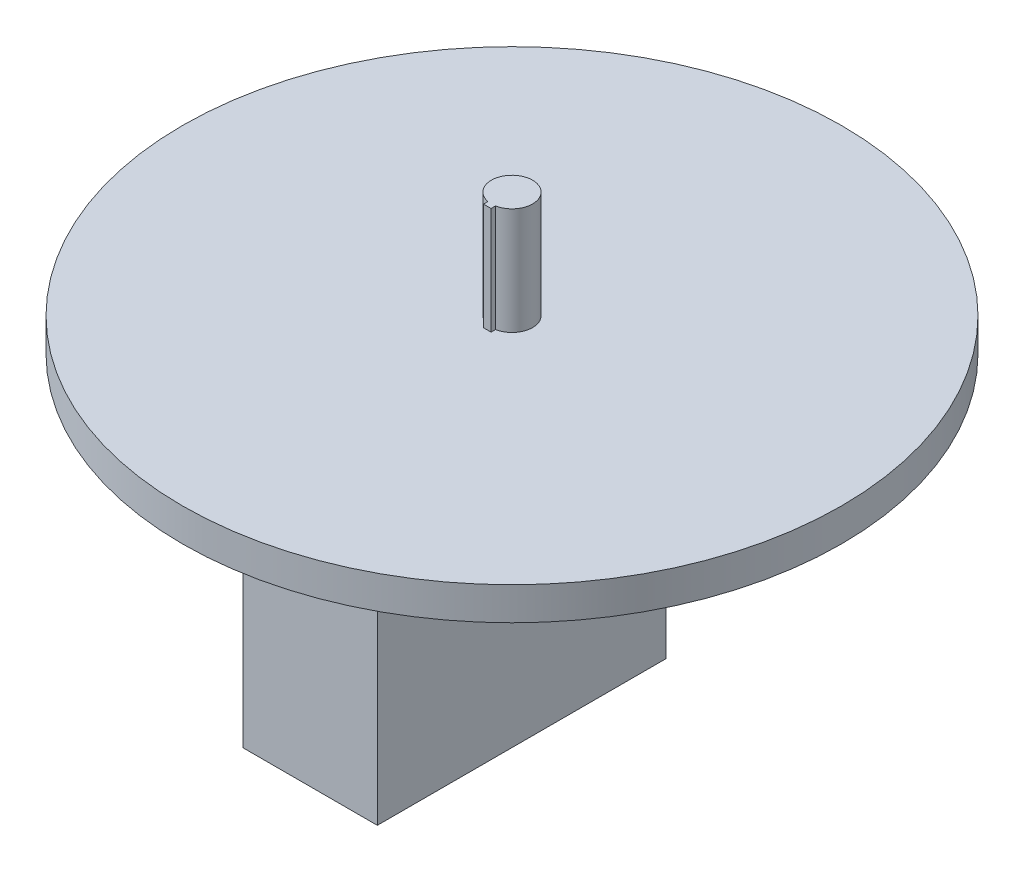
ISO-10303-21;
HEADER;
FILE_DESCRIPTION(('STEP AP214'),'2;1');
FILE_NAME('part.step','',(''),(''),'','','');
FILE_SCHEMA(('AUTOMOTIVE_DESIGN { 1 0 10303 214 1 1 1 1 }'));
ENDSEC;
DATA;
#1=APPLICATION_CONTEXT('core data for automotive mechanical design processes');
#2=APPLICATION_PROTOCOL_DEFINITION('international standard','automotive_design',2000,#1);
#3=PRODUCT_CONTEXT('',#1,'mechanical');
#4=PRODUCT('Part','Part','',(#3));
#5=PRODUCT_RELATED_PRODUCT_CATEGORY('part','',(#4));
#6=PRODUCT_DEFINITION_FORMATION('','',#4);
#7=PRODUCT_DEFINITION_CONTEXT('part definition',#1,'design');
#8=PRODUCT_DEFINITION('design','',#6,#7);
#9=PRODUCT_DEFINITION_SHAPE('','',#8);
#10=(LENGTH_UNIT() NAMED_UNIT(*) SI_UNIT(.MILLI.,.METRE.));
#11=(NAMED_UNIT(*) PLANE_ANGLE_UNIT() SI_UNIT($,.RADIAN.));
#12=(NAMED_UNIT(*) SI_UNIT($,.STERADIAN.) SOLID_ANGLE_UNIT());
#13=UNCERTAINTY_MEASURE_WITH_UNIT(LENGTH_MEASURE(1.E-05),#10,'distance_accuracy_value','');
#14=(GEOMETRIC_REPRESENTATION_CONTEXT(3) GLOBAL_UNCERTAINTY_ASSIGNED_CONTEXT((#13)) GLOBAL_UNIT_ASSIGNED_CONTEXT((#10,
#11,#12)) REPRESENTATION_CONTEXT('',''));
#15=CARTESIAN_POINT('',(0.,0.,0.));
#16=DIRECTION('',(0.,0.,1.));
#17=DIRECTION('',(1.,0.,0.));
#18=AXIS2_PLACEMENT_3D('',#15,#16,#17);
#19=CARTESIAN_POINT('',(0.,-30.,0.));
#20=DIRECTION('',(0.,1.,0.));
#21=DIRECTION('',(0.,0.,1.));
#22=AXIS2_PLACEMENT_3D('',#19,#20,#21);
#23=PLANE('',#22);
#24=CARTESIAN_POINT('',(0.,-30.,0.));
#25=DIRECTION('',(0.,1.,0.));
#26=DIRECTION('',(0.,0.,1.));
#27=AXIS2_PLACEMENT_3D('',#24,#25,#26);
#28=CIRCLE('',#27,400.);
#29=CARTESIAN_POINT('',(0.,-30.,400.));
#30=VERTEX_POINT('',#29);
#31=EDGE_CURVE('E135',#30,#30,#28,.T.);
#32=ORIENTED_EDGE('',*,*,#31,.F.);
#33=EDGE_LOOP('',(#32));
#34=FACE_BOUND('',#33,.T.);
#35=DIRECTION('',(0.,0.,-1.));
#36=VECTOR('',#35,1.);
#37=CARTESIAN_POINT('',(-198.863094003759,-30.,127.51955462953));
#38=LINE('',#37,#36);
#39=CARTESIAN_POINT('',(-198.863094003759,-30.,127.51955462953));
#40=VERTEX_POINT('',#39);
#41=CARTESIAN_POINT('',(-198.863094003759,-30.,-223.018780563537));
#42=VERTEX_POINT('',#41);
#43=EDGE_CURVE('E133',#40,#42,#38,.T.);
#44=ORIENTED_EDGE('',*,*,#43,.F.);
#45=DIRECTION('',(-1.,0.,0.));
#46=VECTOR('',#45,1.);
#47=CARTESIAN_POINT('',(-198.863094003759,-30.,127.51955462953));
#48=LINE('',#47,#46);
#49=CARTESIAN_POINT('',(-35.9526497633915,-30.,127.51955462953));
#50=VERTEX_POINT('',#49);
#51=EDGE_CURVE('E130',#50,#40,#48,.T.);
#52=ORIENTED_EDGE('',*,*,#51,.F.);
#53=DIRECTION('',(0.,0.,1.));
#54=VECTOR('',#53,1.);
#55=CARTESIAN_POINT('',(-35.9526497633915,-30.,127.51955462953));
#56=LINE('',#55,#54);
#57=CARTESIAN_POINT('',(-35.9526497633915,-30.,-223.018780563537));
#58=VERTEX_POINT('',#57);
#59=EDGE_CURVE('E66',#58,#50,#56,.T.);
#60=ORIENTED_EDGE('',*,*,#59,.F.);
#61=DIRECTION('',(1.,0.,0.));
#62=VECTOR('',#61,1.);
#63=CARTESIAN_POINT('',(-198.863094003759,-30.,-223.018780563537));
#64=LINE('',#63,#62);
#65=EDGE_CURVE('E61',#42,#58,#64,.T.);
#66=ORIENTED_EDGE('',*,*,#65,.F.);
#67=EDGE_LOOP('',(#44,#52,#60,#66));
#68=FACE_BOUND('',#67,.T.);
#69=ADVANCED_FACE('F45',(#34,#68),#23,.F.);
#70=CARTESIAN_POINT('',(0.,10.,0.));
#71=DIRECTION('',(0.,1.,0.));
#72=DIRECTION('',(0.,0.,1.));
#73=AXIS2_PLACEMENT_3D('',#70,#71,#72);
#74=PLANE('',#73);
#75=CARTESIAN_POINT('',(0.,10.,0.));
#76=DIRECTION('',(0.,1.,0.));
#77=DIRECTION('',(0.,0.,1.));
#78=AXIS2_PLACEMENT_3D('',#75,#76,#77);
#79=CIRCLE('',#78,400.);
#80=CARTESIAN_POINT('',(0.,10.,400.));
#81=VERTEX_POINT('',#80);
#82=EDGE_CURVE('E11',#81,#81,#79,.T.);
#83=ORIENTED_EDGE('',*,*,#82,.T.);
#84=EDGE_LOOP('',(#83));
#85=FACE_BOUND('',#84,.T.);
#86=DIRECTION('',(0.,0.,1.));
#87=VECTOR('',#86,1.);
#88=CARTESIAN_POINT('',(-4.6,10.,30.015));
#89=LINE('',#88,#87);
#90=CARTESIAN_POINT('',(-4.6,10.,24.5731560854523));
#91=VERTEX_POINT('',#90);
#92=CARTESIAN_POINT('',(-4.6,10.,30.015));
#93=VERTEX_POINT('',#92);
#94=EDGE_CURVE('E164',#91,#93,#89,.T.);
#95=ORIENTED_EDGE('',*,*,#94,.F.);
#96=CARTESIAN_POINT('',(0.,10.,0.));
#97=DIRECTION('',(0.,1.,0.));
#98=DIRECTION('',(0.,0.,1.));
#99=AXIS2_PLACEMENT_3D('',#96,#97,#98);
#100=CIRCLE('',#99,25.);
#101=CARTESIAN_POINT('',(4.6,10.,24.5731560854523));
#102=VERTEX_POINT('',#101);
#103=EDGE_CURVE('E140',#102,#91,#100,.T.);
#104=ORIENTED_EDGE('',*,*,#103,.F.);
#105=DIRECTION('',(0.,0.,-1.));
#106=VECTOR('',#105,1.);
#107=CARTESIAN_POINT('',(4.6,10.,30.015));
#108=LINE('',#107,#106);
#109=CARTESIAN_POINT('',(4.6,10.,30.015));
#110=VERTEX_POINT('',#109);
#111=EDGE_CURVE('E151',#110,#102,#108,.T.);
#112=ORIENTED_EDGE('',*,*,#111,.F.);
#113=DIRECTION('',(1.,0.,0.));
#114=VECTOR('',#113,1.);
#115=CARTESIAN_POINT('',(-4.6,10.,30.015));
#116=LINE('',#115,#114);
#117=EDGE_CURVE('E167',#93,#110,#116,.T.);
#118=ORIENTED_EDGE('',*,*,#117,.F.);
#119=EDGE_LOOP('',(#95,#104,#112,#118));
#120=FACE_BOUND('',#119,.T.);
#121=ADVANCED_FACE('F196',(#85,#120),#74,.T.);
#122=CARTESIAN_POINT('',(0.,10.,0.));
#123=DIRECTION('',(0.,-1.,0.));
#124=DIRECTION('',(0.,0.,-1.));
#125=AXIS2_PLACEMENT_3D('',#122,#123,#124);
#126=CYLINDRICAL_SURFACE('',#125,400.);
#127=ORIENTED_EDGE('',*,*,#82,.F.);
#128=EDGE_LOOP('',(#127));
#129=FACE_BOUND('',#128,.T.);
#130=ORIENTED_EDGE('',*,*,#31,.T.);
#131=EDGE_LOOP('',(#130));
#132=FACE_BOUND('',#131,.T.);
#133=ADVANCED_FACE('F47',(#129,#132),#126,.T.);
#134=CARTESIAN_POINT('',(0.,140.,0.));
#135=DIRECTION('',(0.,-1.,0.));
#136=DIRECTION('',(0.,0.,-1.));
#137=AXIS2_PLACEMENT_3D('',#134,#135,#136);
#138=CYLINDRICAL_SURFACE('',#137,25.);
#139=ORIENTED_EDGE('',*,*,#103,.T.);
#140=DIRECTION('',(0.,-1.,0.));
#141=VECTOR('',#140,1.);
#142=CARTESIAN_POINT('',(-4.6,140.,24.5731560854523));
#143=LINE('',#142,#141);
#144=CARTESIAN_POINT('',(-4.6,140.,24.5731560854523));
#145=VERTEX_POINT('',#144);
#146=EDGE_CURVE('E54',#145,#91,#143,.T.);
#147=ORIENTED_EDGE('',*,*,#146,.F.);
#148=CARTESIAN_POINT('',(0.,140.,0.));
#149=DIRECTION('',(0.,1.,0.));
#150=DIRECTION('',(0.,0.,1.));
#151=AXIS2_PLACEMENT_3D('',#148,#149,#150);
#152=CIRCLE('',#151,25.);
#153=CARTESIAN_POINT('',(4.6,140.,24.5731560854523));
#154=VERTEX_POINT('',#153);
#155=EDGE_CURVE('E146',#154,#145,#152,.T.);
#156=ORIENTED_EDGE('',*,*,#155,.F.);
#157=DIRECTION('',(0.,-1.,0.));
#158=VECTOR('',#157,1.);
#159=CARTESIAN_POINT('',(4.6,140.,24.5731560854523));
#160=LINE('',#159,#158);
#161=EDGE_CURVE('E160',#154,#102,#160,.T.);
#162=ORIENTED_EDGE('',*,*,#161,.T.);
#163=EDGE_LOOP('',(#139,#147,#156,#162));
#164=FACE_BOUND('',#163,.T.);
#165=ADVANCED_FACE('F191',(#164),#138,.T.);
#166=CARTESIAN_POINT('',(-4.6,140.,30.015));
#167=DIRECTION('',(1.,0.,0.));
#168=DIRECTION('',(0.,0.,-1.));
#169=AXIS2_PLACEMENT_3D('',#166,#167,#168);
#170=PLANE('',#169);
#171=ORIENTED_EDGE('',*,*,#94,.T.);
#172=DIRECTION('',(0.,-1.,0.));
#173=VECTOR('',#172,1.);
#174=CARTESIAN_POINT('',(-4.6,140.,30.015));
#175=LINE('',#174,#173);
#176=CARTESIAN_POINT('',(-4.6,140.,30.015));
#177=VERTEX_POINT('',#176);
#178=EDGE_CURVE('E179',#177,#93,#175,.T.);
#179=ORIENTED_EDGE('',*,*,#178,.F.);
#180=DIRECTION('',(0.,0.,1.));
#181=VECTOR('',#180,1.);
#182=CARTESIAN_POINT('',(-4.6,140.,30.015));
#183=LINE('',#182,#181);
#184=EDGE_CURVE('E150',#145,#177,#183,.T.);
#185=ORIENTED_EDGE('',*,*,#184,.F.);
#186=ORIENTED_EDGE('',*,*,#146,.T.);
#187=EDGE_LOOP('',(#171,#179,#185,#186));
#188=FACE_BOUND('',#187,.T.);
#189=ADVANCED_FACE('F185',(#188),#170,.F.);
#190=CARTESIAN_POINT('',(-4.6,140.,30.015));
#191=DIRECTION('',(0.,0.,-1.));
#192=DIRECTION('',(-1.,0.,0.));
#193=AXIS2_PLACEMENT_3D('',#190,#191,#192);
#194=PLANE('',#193);
#195=ORIENTED_EDGE('',*,*,#117,.T.);
#196=DIRECTION('',(0.,-1.,0.));
#197=VECTOR('',#196,1.);
#198=CARTESIAN_POINT('',(4.6,140.,30.015));
#199=LINE('',#198,#197);
#200=CARTESIAN_POINT('',(4.6,140.,30.015));
#201=VERTEX_POINT('',#200);
#202=EDGE_CURVE('E176',#201,#110,#199,.T.);
#203=ORIENTED_EDGE('',*,*,#202,.F.);
#204=DIRECTION('',(1.,0.,0.));
#205=VECTOR('',#204,1.);
#206=CARTESIAN_POINT('',(-4.6,140.,30.015));
#207=LINE('',#206,#205);
#208=EDGE_CURVE('E154',#177,#201,#207,.T.);
#209=ORIENTED_EDGE('',*,*,#208,.F.);
#210=ORIENTED_EDGE('',*,*,#178,.T.);
#211=EDGE_LOOP('',(#195,#203,#209,#210));
#212=FACE_BOUND('',#211,.T.);
#213=ADVANCED_FACE('F199',(#212),#194,.F.);
#214=CARTESIAN_POINT('',(4.6,140.,30.015));
#215=DIRECTION('',(-1.,0.,0.));
#216=DIRECTION('',(0.,0.,1.));
#217=AXIS2_PLACEMENT_3D('',#214,#215,#216);
#218=PLANE('',#217);
#219=ORIENTED_EDGE('',*,*,#111,.T.);
#220=ORIENTED_EDGE('',*,*,#161,.F.);
#221=DIRECTION('',(0.,0.,-1.));
#222=VECTOR('',#221,1.);
#223=CARTESIAN_POINT('',(4.6,140.,30.015));
#224=LINE('',#223,#222);
#225=EDGE_CURVE('E157',#201,#154,#224,.T.);
#226=ORIENTED_EDGE('',*,*,#225,.F.);
#227=ORIENTED_EDGE('',*,*,#202,.T.);
#228=EDGE_LOOP('',(#219,#220,#226,#227));
#229=FACE_BOUND('',#228,.T.);
#230=ADVANCED_FACE('F205',(#229),#218,.F.);
#231=CARTESIAN_POINT('',(0.,140.,0.));
#232=DIRECTION('',(0.,1.,0.));
#233=DIRECTION('',(0.,0.,1.));
#234=AXIS2_PLACEMENT_3D('',#231,#232,#233);
#235=PLANE('',#234);
#236=ORIENTED_EDGE('',*,*,#155,.T.);
#237=ORIENTED_EDGE('',*,*,#184,.T.);
#238=ORIENTED_EDGE('',*,*,#208,.T.);
#239=ORIENTED_EDGE('',*,*,#225,.T.);
#240=EDGE_LOOP('',(#236,#237,#238,#239));
#241=FACE_BOUND('',#240,.T.);
#242=ADVANCED_FACE('F203',(#241),#235,.T.);
#243=CARTESIAN_POINT('',(-198.863094003759,-480.,127.51955462953));
#244=DIRECTION('',(1.,0.,0.));
#245=DIRECTION('',(0.,0.,-1.));
#246=AXIS2_PLACEMENT_3D('',#243,#244,#245);
#247=PLANE('',#246);
#248=ORIENTED_EDGE('',*,*,#43,.T.);
#249=DIRECTION('',(0.,1.,0.));
#250=VECTOR('',#249,1.);
#251=CARTESIAN_POINT('',(-198.863094003759,-480.,-223.018780563537));
#252=LINE('',#251,#250);
#253=CARTESIAN_POINT('',(-198.863094003759,-480.,-223.018780563537));
#254=VERTEX_POINT('',#253);
#255=EDGE_CURVE('E112',#254,#42,#252,.T.);
#256=ORIENTED_EDGE('',*,*,#255,.F.);
#257=DIRECTION('',(0.,0.,-1.));
#258=VECTOR('',#257,1.);
#259=CARTESIAN_POINT('',(-198.863094003759,-480.,127.51955462953));
#260=LINE('',#259,#258);
#261=CARTESIAN_POINT('',(-198.863094003759,-480.,127.51955462953));
#262=VERTEX_POINT('',#261);
#263=EDGE_CURVE('E120',#262,#254,#260,.T.);
#264=ORIENTED_EDGE('',*,*,#263,.F.);
#265=DIRECTION('',(0.,1.,0.));
#266=VECTOR('',#265,1.);
#267=CARTESIAN_POINT('',(-198.863094003759,-480.,127.51955462953));
#268=LINE('',#267,#266);
#269=EDGE_CURVE('E323',#262,#40,#268,.T.);
#270=ORIENTED_EDGE('',*,*,#269,.T.);
#271=EDGE_LOOP('',(#248,#256,#264,#270));
#272=FACE_BOUND('',#271,.T.);
#273=ADVANCED_FACE('F132',(#272),#247,.F.);
#274=CARTESIAN_POINT('',(-198.863094003759,-480.,-223.018780563537));
#275=DIRECTION('',(0.,0.,1.));
#276=DIRECTION('',(1.,0.,0.));
#277=AXIS2_PLACEMENT_3D('',#274,#275,#276);
#278=PLANE('',#277);
#279=ORIENTED_EDGE('',*,*,#65,.T.);
#280=DIRECTION('',(0.,1.,0.));
#281=VECTOR('',#280,1.);
#282=CARTESIAN_POINT('',(-35.9526497633915,-480.,-223.018780563537));
#283=LINE('',#282,#281);
#284=CARTESIAN_POINT('',(-35.9526497633915,-480.,-223.018780563537));
#285=VERTEX_POINT('',#284);
#286=EDGE_CURVE('E115',#285,#58,#283,.T.);
#287=ORIENTED_EDGE('',*,*,#286,.F.);
#288=DIRECTION('',(1.,0.,0.));
#289=VECTOR('',#288,1.);
#290=CARTESIAN_POINT('',(-198.863094003759,-480.,-223.018780563537));
#291=LINE('',#290,#289);
#292=EDGE_CURVE('E108',#254,#285,#291,.T.);
#293=ORIENTED_EDGE('',*,*,#292,.F.);
#294=ORIENTED_EDGE('',*,*,#255,.T.);
#295=EDGE_LOOP('',(#279,#287,#293,#294));
#296=FACE_BOUND('',#295,.T.);
#297=ADVANCED_FACE('F110',(#296),#278,.F.);
#298=CARTESIAN_POINT('',(-35.9526497633915,-480.,127.51955462953));
#299=DIRECTION('',(-1.,0.,0.));
#300=DIRECTION('',(0.,0.,1.));
#301=AXIS2_PLACEMENT_3D('',#298,#299,#300);
#302=PLANE('',#301);
#303=ORIENTED_EDGE('',*,*,#59,.T.);
#304=DIRECTION('',(0.,1.,0.));
#305=VECTOR('',#304,1.);
#306=CARTESIAN_POINT('',(-35.9526497633915,-480.,127.51955462953));
#307=LINE('',#306,#305);
#308=CARTESIAN_POINT('',(-35.9526497633915,-480.,127.51955462953));
#309=VERTEX_POINT('',#308);
#310=EDGE_CURVE('E142',#309,#50,#307,.T.);
#311=ORIENTED_EDGE('',*,*,#310,.F.);
#312=DIRECTION('',(0.,0.,1.));
#313=VECTOR('',#312,1.);
#314=CARTESIAN_POINT('',(-35.9526497633915,-480.,127.51955462953));
#315=LINE('',#314,#313);
#316=EDGE_CURVE('E119',#285,#309,#315,.T.);
#317=ORIENTED_EDGE('',*,*,#316,.F.);
#318=ORIENTED_EDGE('',*,*,#286,.T.);
#319=EDGE_LOOP('',(#303,#311,#317,#318));
#320=FACE_BOUND('',#319,.T.);
#321=ADVANCED_FACE('F228',(#320),#302,.F.);
#322=CARTESIAN_POINT('',(-198.863094003759,-480.,127.51955462953));
#323=DIRECTION('',(0.,0.,-1.));
#324=DIRECTION('',(-1.,0.,0.));
#325=AXIS2_PLACEMENT_3D('',#322,#323,#324);
#326=PLANE('',#325);
#327=ORIENTED_EDGE('',*,*,#51,.T.);
#328=ORIENTED_EDGE('',*,*,#269,.F.);
#329=DIRECTION('',(-1.,0.,0.));
#330=VECTOR('',#329,1.);
#331=CARTESIAN_POINT('',(-198.863094003759,-480.,127.51955462953));
#332=LINE('',#331,#330);
#333=EDGE_CURVE('E125',#309,#262,#332,.T.);
#334=ORIENTED_EDGE('',*,*,#333,.F.);
#335=ORIENTED_EDGE('',*,*,#310,.T.);
#336=EDGE_LOOP('',(#327,#328,#334,#335));
#337=FACE_BOUND('',#336,.T.);
#338=ADVANCED_FACE('F231',(#337),#326,.F.);
#339=CARTESIAN_POINT('',(0.,-480.,0.));
#340=DIRECTION('',(0.,-1.,0.));
#341=DIRECTION('',(0.,0.,-1.));
#342=AXIS2_PLACEMENT_3D('',#339,#340,#341);
#343=PLANE('',#342);
#344=ORIENTED_EDGE('',*,*,#263,.T.);
#345=ORIENTED_EDGE('',*,*,#292,.T.);
#346=ORIENTED_EDGE('',*,*,#316,.T.);
#347=ORIENTED_EDGE('',*,*,#333,.T.);
#348=EDGE_LOOP('',(#344,#345,#346,#347));
#349=FACE_BOUND('',#348,.T.);
#350=ADVANCED_FACE('F123',(#349),#343,.T.);
#351=CLOSED_SHELL('',(#69,#121,#133,#165,#189,#213,#230,#242,#273,#297,#321,#338,#350));
#352=MANIFOLD_SOLID_BREP('B2',#351);
#353=ADVANCED_BREP_SHAPE_REPRESENTATION('',(#18,#352),#14);
#354=SHAPE_DEFINITION_REPRESENTATION(#9,#353);
ENDSEC;
END-ISO-10303-21;
